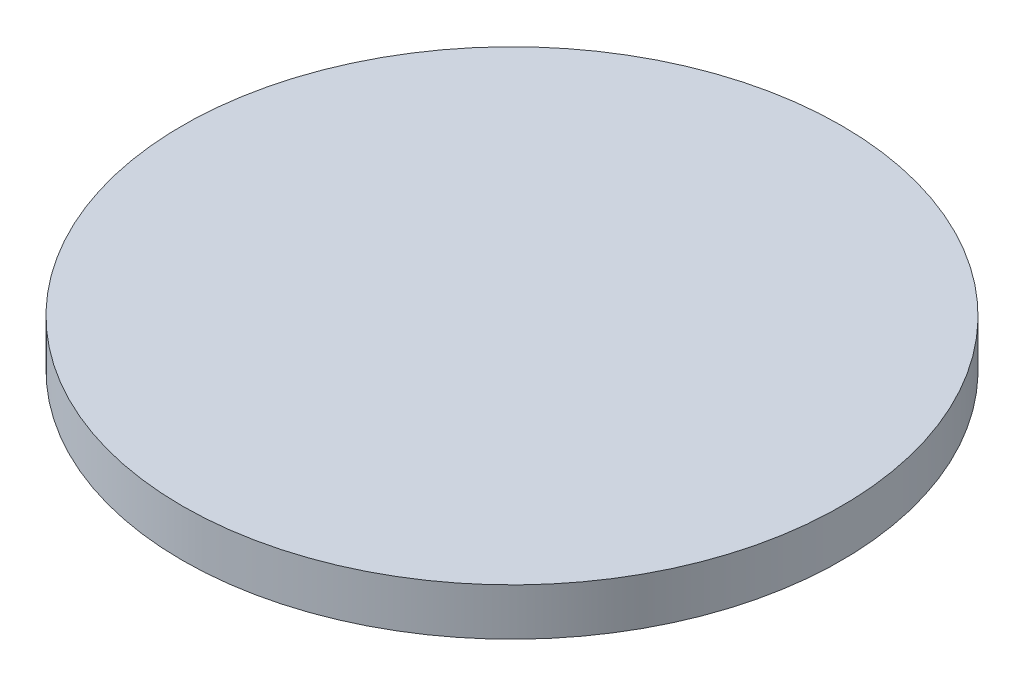
ISO-10303-21;
HEADER;
FILE_DESCRIPTION(('STEP AP214'),'2;1');
FILE_NAME('part.step','',(''),(''),'','','');
FILE_SCHEMA(('AUTOMOTIVE_DESIGN { 1 0 10303 214 1 1 1 1 }'));
ENDSEC;
DATA;
#1=APPLICATION_CONTEXT('core data for automotive mechanical design processes');
#2=APPLICATION_PROTOCOL_DEFINITION('international standard','automotive_design',2000,#1);
#3=PRODUCT_CONTEXT('',#1,'mechanical');
#4=PRODUCT('Part','Part','',(#3));
#5=PRODUCT_RELATED_PRODUCT_CATEGORY('part','',(#4));
#6=PRODUCT_DEFINITION_FORMATION('','',#4);
#7=PRODUCT_DEFINITION_CONTEXT('part definition',#1,'design');
#8=PRODUCT_DEFINITION('design','',#6,#7);
#9=PRODUCT_DEFINITION_SHAPE('','',#8);
#10=(LENGTH_UNIT() NAMED_UNIT(*) SI_UNIT(.MILLI.,.METRE.));
#11=(NAMED_UNIT(*) PLANE_ANGLE_UNIT() SI_UNIT($,.RADIAN.));
#12=(NAMED_UNIT(*) SI_UNIT($,.STERADIAN.) SOLID_ANGLE_UNIT());
#13=UNCERTAINTY_MEASURE_WITH_UNIT(LENGTH_MEASURE(1.E-05),#10,'distance_accuracy_value','');
#14=(GEOMETRIC_REPRESENTATION_CONTEXT(3) GLOBAL_UNCERTAINTY_ASSIGNED_CONTEXT((#13)) GLOBAL_UNIT_ASSIGNED_CONTEXT((#10,
#11,#12)) REPRESENTATION_CONTEXT('',''));
#15=CARTESIAN_POINT('',(0.,0.,0.));
#16=DIRECTION('',(0.,0.,1.));
#17=DIRECTION('',(1.,0.,0.));
#18=AXIS2_PLACEMENT_3D('',#15,#16,#17);
#19=CARTESIAN_POINT('',(0.,10.,0.));
#20=DIRECTION('',(0.,-1.,0.));
#21=DIRECTION('',(0.,0.,-1.));
#22=AXIS2_PLACEMENT_3D('',#19,#20,#21);
#23=CYLINDRICAL_SURFACE('',#22,70.);
#24=CARTESIAN_POINT('',(0.,10.,0.));
#25=DIRECTION('',(0.,1.,0.));
#26=DIRECTION('',(0.,0.,1.));
#27=AXIS2_PLACEMENT_3D('',#24,#25,#26);
#28=CIRCLE('',#27,70.);
#29=CARTESIAN_POINT('',(0.,10.,70.));
#30=VERTEX_POINT('',#29);
#31=EDGE_CURVE('E10',#30,#30,#28,.T.);
#32=ORIENTED_EDGE('',*,*,#31,.F.);
#33=EDGE_LOOP('',(#32));
#34=FACE_BOUND('',#33,.T.);
#35=CARTESIAN_POINT('',(0.,0.,0.));
#36=DIRECTION('',(0.,1.,0.));
#37=DIRECTION('',(0.,0.,1.));
#38=AXIS2_PLACEMENT_3D('',#35,#36,#37);
#39=CIRCLE('',#38,70.);
#40=CARTESIAN_POINT('',(0.,0.,70.));
#41=VERTEX_POINT('',#40);
#42=EDGE_CURVE('E34',#41,#41,#39,.T.);
#43=ORIENTED_EDGE('',*,*,#42,.T.);
#44=EDGE_LOOP('',(#43));
#45=FACE_BOUND('',#44,.T.);
#46=ADVANCED_FACE('F31',(#34,#45),#23,.T.);
#47=CARTESIAN_POINT('',(0.,10.,0.));
#48=DIRECTION('',(0.,1.,0.));
#49=DIRECTION('',(0.,0.,1.));
#50=AXIS2_PLACEMENT_3D('',#47,#48,#49);
#51=PLANE('',#50);
#52=ORIENTED_EDGE('',*,*,#31,.T.);
#53=EDGE_LOOP('',(#52));
#54=FACE_BOUND('',#53,.T.);
#55=ADVANCED_FACE('F46',(#54),#51,.T.);
#56=CARTESIAN_POINT('',(0.,0.,0.));
#57=DIRECTION('',(0.,1.,0.));
#58=DIRECTION('',(0.,0.,1.));
#59=AXIS2_PLACEMENT_3D('',#56,#57,#58);
#60=PLANE('',#59);
#61=ORIENTED_EDGE('',*,*,#42,.F.);
#62=EDGE_LOOP('',(#61));
#63=FACE_BOUND('',#62,.T.);
#64=ADVANCED_FACE('F44',(#63),#60,.F.);
#65=CLOSED_SHELL('',(#46,#55,#64));
#66=MANIFOLD_SOLID_BREP('B2',#65);
#67=ADVANCED_BREP_SHAPE_REPRESENTATION('',(#18,#66),#14);
#68=SHAPE_DEFINITION_REPRESENTATION(#9,#67);
ENDSEC;
END-ISO-10303-21;
